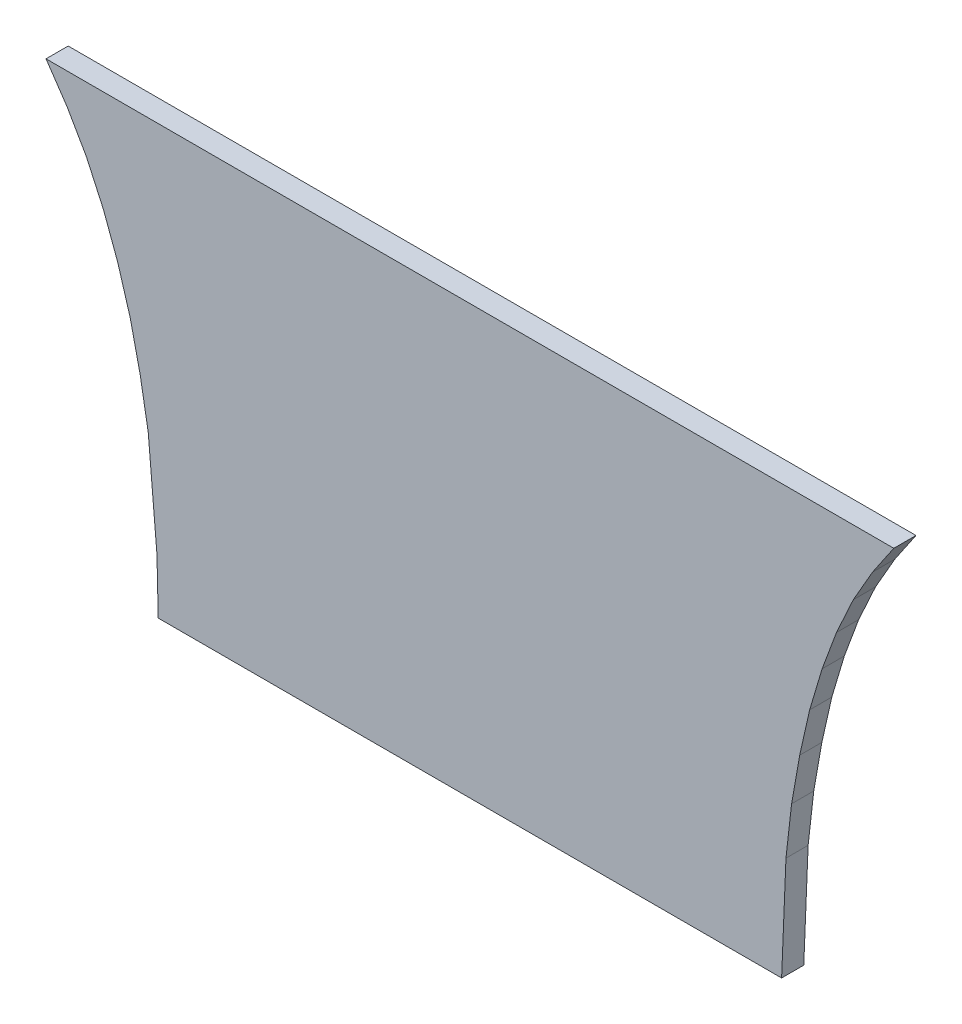
ISO-10303-21;
HEADER;
FILE_DESCRIPTION(('STEP AP214'),'2;1');
FILE_NAME('part.step','',(''),(''),'','','');
FILE_SCHEMA(('AUTOMOTIVE_DESIGN { 1 0 10303 214 1 1 1 1 }'));
ENDSEC;
DATA;
#1=APPLICATION_CONTEXT('core data for automotive mechanical design processes');
#2=APPLICATION_PROTOCOL_DEFINITION('international standard','automotive_design',2000,#1);
#3=PRODUCT_CONTEXT('',#1,'mechanical');
#4=PRODUCT('Part','Part','',(#3));
#5=PRODUCT_RELATED_PRODUCT_CATEGORY('part','',(#4));
#6=PRODUCT_DEFINITION_FORMATION('','',#4);
#7=PRODUCT_DEFINITION_CONTEXT('part definition',#1,'design');
#8=PRODUCT_DEFINITION('design','',#6,#7);
#9=PRODUCT_DEFINITION_SHAPE('','',#8);
#10=(LENGTH_UNIT() NAMED_UNIT(*) SI_UNIT(.MILLI.,.METRE.));
#11=(NAMED_UNIT(*) PLANE_ANGLE_UNIT() SI_UNIT($,.RADIAN.));
#12=(NAMED_UNIT(*) SI_UNIT($,.STERADIAN.) SOLID_ANGLE_UNIT());
#13=UNCERTAINTY_MEASURE_WITH_UNIT(LENGTH_MEASURE(1.E-05),#10,'distance_accuracy_value','');
#14=(GEOMETRIC_REPRESENTATION_CONTEXT(3) GLOBAL_UNCERTAINTY_ASSIGNED_CONTEXT((#13)) GLOBAL_UNIT_ASSIGNED_CONTEXT((#10,
#11,#12)) REPRESENTATION_CONTEXT('',''));
#15=CARTESIAN_POINT('',(0.,0.,0.));
#16=DIRECTION('',(0.,0.,1.));
#17=DIRECTION('',(1.,0.,0.));
#18=AXIS2_PLACEMENT_3D('',#15,#16,#17);
#19=CARTESIAN_POINT('',(57.9199981689453,61.4029998779297,0.));
#20=DIRECTION('',(-0.999153352742579,0.0411409492265821,0.));
#21=DIRECTION('',(0.0411409492265821,0.999153352742579,0.));
#22=AXIS2_PLACEMENT_3D('',#19,#20,#21);
#23=PLANE('',#22);
#24=DIRECTION('',(0.0411409492265821,0.999153352742579,0.));
#25=VECTOR('',#24,1.);
#26=CARTESIAN_POINT('',(57.9199981689453,61.4029998779297,0.03556));
#27=LINE('',#26,#25);
#28=CARTESIAN_POINT('',(57.9199981689453,61.4029998779297,0.03556));
#29=VERTEX_POINT('',#28);
#30=CARTESIAN_POINT('',(57.9269981384277,61.5730018615723,0.03556));
#31=VERTEX_POINT('',#30);
#32=EDGE_CURVE('E11',#29,#31,#27,.T.);
#33=ORIENTED_EDGE('',*,*,#32,.F.);
#34=DIRECTION('',(0.,0.,1.));
#35=VECTOR('',#34,1.);
#36=CARTESIAN_POINT('',(57.9199981689453,61.4029998779297,0.));
#37=LINE('',#36,#35);
#38=CARTESIAN_POINT('',(57.9199981689453,61.4029998779297,0.));
#39=VERTEX_POINT('',#38);
#40=EDGE_CURVE('E24',#39,#29,#37,.T.);
#41=ORIENTED_EDGE('',*,*,#40,.F.);
#42=DIRECTION('',(0.0411409492265821,0.999153352742579,0.));
#43=VECTOR('',#42,1.);
#44=CARTESIAN_POINT('',(57.9199981689453,61.4029998779297,0.));
#45=LINE('',#44,#43);
#46=CARTESIAN_POINT('',(57.9269981384277,61.5730018615723,0.));
#47=VERTEX_POINT('',#46);
#48=EDGE_CURVE('E172',#39,#47,#45,.T.);
#49=ORIENTED_EDGE('',*,*,#48,.T.);
#50=DIRECTION('',(0.,0.,1.));
#51=VECTOR('',#50,1.);
#52=CARTESIAN_POINT('',(57.9269981384277,61.5730018615723,0.));
#53=LINE('',#52,#51);
#54=EDGE_CURVE('E37',#47,#31,#53,.T.);
#55=ORIENTED_EDGE('',*,*,#54,.T.);
#56=EDGE_LOOP('',(#33,#41,#49,#55));
#57=FACE_BOUND('',#56,.T.);
#58=ADVANCED_FACE('F17',(#57),#23,.F.);
#59=CARTESIAN_POINT('',(57.9269981384277,61.5730018615723,0.));
#60=DIRECTION('',(-0.993727301508674,0.111830453080944,0.));
#61=DIRECTION('',(0.111830453080944,0.993727301508674,0.));
#62=AXIS2_PLACEMENT_3D('',#59,#60,#61);
#63=PLANE('',#62);
#64=DIRECTION('',(0.111830453080944,0.993727301508674,0.));
#65=VECTOR('',#64,1.);
#66=CARTESIAN_POINT('',(57.9269981384277,61.5730018615723,0.03556));
#67=LINE('',#66,#65);
#68=CARTESIAN_POINT('',(57.9360008239746,61.6529998779297,0.03556));
#69=VERTEX_POINT('',#68);
#70=EDGE_CURVE('E308',#31,#69,#67,.T.);
#71=ORIENTED_EDGE('',*,*,#70,.F.);
#72=ORIENTED_EDGE('',*,*,#54,.F.);
#73=DIRECTION('',(0.111830453080944,0.993727301508674,0.));
#74=VECTOR('',#73,1.);
#75=CARTESIAN_POINT('',(57.9269981384277,61.5730018615723,0.));
#76=LINE('',#75,#74);
#77=CARTESIAN_POINT('',(57.9360008239746,61.6529998779297,0.));
#78=VERTEX_POINT('',#77);
#79=EDGE_CURVE('E305',#47,#78,#76,.T.);
#80=ORIENTED_EDGE('',*,*,#79,.T.);
#81=DIRECTION('',(0.,0.,1.));
#82=VECTOR('',#81,1.);
#83=CARTESIAN_POINT('',(57.9360008239746,61.6529998779297,0.));
#84=LINE('',#83,#82);
#85=EDGE_CURVE('E303',#78,#69,#84,.T.);
#86=ORIENTED_EDGE('',*,*,#85,.T.);
#87=EDGE_LOOP('',(#71,#72,#80,#86));
#88=FACE_BOUND('',#87,.T.);
#89=ADVANCED_FACE('F316',(#88),#63,.F.);
#90=CARTESIAN_POINT('',(57.9360008239746,61.6529998779297,0.));
#91=DIRECTION('',(-0.984916671687,0.173029332290804,0.));
#92=DIRECTION('',(0.173029332290804,0.984916671687,0.));
#93=AXIS2_PLACEMENT_3D('',#90,#91,#92);
#94=PLANE('',#93);
#95=DIRECTION('',(0.173029332290804,0.984916671687,0.));
#96=VECTOR('',#95,1.);
#97=CARTESIAN_POINT('',(57.9360008239746,61.6529998779297,0.03556));
#98=LINE('',#97,#96);
#99=CARTESIAN_POINT('',(57.9490013122559,61.7270011901855,0.03556));
#100=VERTEX_POINT('',#99);
#101=EDGE_CURVE('E300',#69,#100,#98,.T.);
#102=ORIENTED_EDGE('',*,*,#101,.F.);
#103=ORIENTED_EDGE('',*,*,#85,.F.);
#104=DIRECTION('',(0.173029332290804,0.984916671687,0.));
#105=VECTOR('',#104,1.);
#106=CARTESIAN_POINT('',(57.9360008239746,61.6529998779297,0.));
#107=LINE('',#106,#105);
#108=CARTESIAN_POINT('',(57.9490013122559,61.7270011901855,0.));
#109=VERTEX_POINT('',#108);
#110=EDGE_CURVE('E297',#78,#109,#107,.T.);
#111=ORIENTED_EDGE('',*,*,#110,.T.);
#112=DIRECTION('',(0.,0.,1.));
#113=VECTOR('',#112,1.);
#114=CARTESIAN_POINT('',(57.9490013122559,61.7270011901855,0.));
#115=LINE('',#114,#113);
#116=EDGE_CURVE('E295',#109,#100,#115,.T.);
#117=ORIENTED_EDGE('',*,*,#116,.T.);
#118=EDGE_LOOP('',(#102,#103,#111,#117));
#119=FACE_BOUND('',#118,.T.);
#120=ADVANCED_FACE('F322',(#119),#94,.F.);
#121=CARTESIAN_POINT('',(57.9490013122559,61.7270011901855,0.));
#122=DIRECTION('',(-0.975538987966482,0.219826483748733,0.));
#123=DIRECTION('',(0.219826483748733,0.975538987966482,0.));
#124=AXIS2_PLACEMENT_3D('',#121,#122,#123);
#125=PLANE('',#124);
#126=DIRECTION('',(0.219826483748733,0.975538987966482,0.));
#127=VECTOR('',#126,1.);
#128=CARTESIAN_POINT('',(57.9490013122559,61.7270011901855,0.03556));
#129=LINE('',#128,#127);
#130=CARTESIAN_POINT('',(57.9650001525879,61.7980003356934,0.03556));
#131=VERTEX_POINT('',#130);
#132=EDGE_CURVE('E292',#100,#131,#129,.T.);
#133=ORIENTED_EDGE('',*,*,#132,.F.);
#134=ORIENTED_EDGE('',*,*,#116,.F.);
#135=DIRECTION('',(0.219826483748733,0.975538987966482,0.));
#136=VECTOR('',#135,1.);
#137=CARTESIAN_POINT('',(57.9490013122559,61.7270011901855,0.));
#138=LINE('',#137,#136);
#139=CARTESIAN_POINT('',(57.9650001525879,61.7980003356934,0.));
#140=VERTEX_POINT('',#139);
#141=EDGE_CURVE('E289',#109,#140,#138,.T.);
#142=ORIENTED_EDGE('',*,*,#141,.T.);
#143=DIRECTION('',(0.,0.,1.));
#144=VECTOR('',#143,1.);
#145=CARTESIAN_POINT('',(57.9650001525879,61.7980003356934,0.));
#146=LINE('',#145,#144);
#147=EDGE_CURVE('E287',#140,#131,#146,.T.);
#148=ORIENTED_EDGE('',*,*,#147,.T.);
#149=EDGE_LOOP('',(#133,#134,#142,#148));
#150=FACE_BOUND('',#149,.T.);
#151=ADVANCED_FACE('F324',(#150),#125,.F.);
#152=CARTESIAN_POINT('',(57.9650001525879,61.7980003356934,0.));
#153=DIRECTION('',(-0.958218790223058,0.28603627403436,0.));
#154=DIRECTION('',(0.28603627403436,0.958218790223058,0.));
#155=AXIS2_PLACEMENT_3D('',#152,#153,#154);
#156=PLANE('',#155);
#157=DIRECTION('',(0.28603627403436,0.958218790223058,0.));
#158=VECTOR('',#157,1.);
#159=CARTESIAN_POINT('',(57.9650001525879,61.7980003356934,0.03556));
#160=LINE('',#159,#158);
#161=CARTESIAN_POINT('',(57.9850006103516,61.8650016784668,0.03556));
#162=VERTEX_POINT('',#161);
#163=EDGE_CURVE('E284',#131,#162,#160,.T.);
#164=ORIENTED_EDGE('',*,*,#163,.F.);
#165=ORIENTED_EDGE('',*,*,#147,.F.);
#166=DIRECTION('',(0.28603627403436,0.958218790223058,0.));
#167=VECTOR('',#166,1.);
#168=CARTESIAN_POINT('',(57.9650001525879,61.7980003356934,0.));
#169=LINE('',#168,#167);
#170=CARTESIAN_POINT('',(57.9850006103516,61.8650016784668,0.));
#171=VERTEX_POINT('',#170);
#172=EDGE_CURVE('E281',#140,#171,#169,.T.);
#173=ORIENTED_EDGE('',*,*,#172,.T.);
#174=DIRECTION('',(0.,0.,1.));
#175=VECTOR('',#174,1.);
#176=CARTESIAN_POINT('',(57.9850006103516,61.8650016784668,0.));
#177=LINE('',#176,#175);
#178=EDGE_CURVE('E279',#171,#162,#177,.T.);
#179=ORIENTED_EDGE('',*,*,#178,.T.);
#180=EDGE_LOOP('',(#164,#165,#173,#179));
#181=FACE_BOUND('',#180,.T.);
#182=ADVANCED_FACE('F329',(#181),#156,.F.);
#183=CARTESIAN_POINT('',(57.9850006103516,61.8650016784668,0.));
#184=DIRECTION('',(-0.937565611569886,0.347808458783832,0.));
#185=DIRECTION('',(0.347808458783832,0.937565611569886,0.));
#186=AXIS2_PLACEMENT_3D('',#183,#184,#185);
#187=PLANE('',#186);
#188=DIRECTION('',(0.347808458783832,0.937565611569886,0.));
#189=VECTOR('',#188,1.);
#190=CARTESIAN_POINT('',(57.9850006103516,61.8650016784668,0.03556));
#191=LINE('',#190,#189);
#192=CARTESIAN_POINT('',(58.007999420166,61.9269981384277,0.03556));
#193=VERTEX_POINT('',#192);
#194=EDGE_CURVE('E276',#162,#193,#191,.T.);
#195=ORIENTED_EDGE('',*,*,#194,.F.);
#196=ORIENTED_EDGE('',*,*,#178,.F.);
#197=DIRECTION('',(0.347808458783832,0.937565611569886,0.));
#198=VECTOR('',#197,1.);
#199=CARTESIAN_POINT('',(57.9850006103516,61.8650016784668,0.));
#200=LINE('',#199,#198);
#201=CARTESIAN_POINT('',(58.007999420166,61.9269981384277,0.));
#202=VERTEX_POINT('',#201);
#203=EDGE_CURVE('E273',#171,#202,#200,.T.);
#204=ORIENTED_EDGE('',*,*,#203,.T.);
#205=DIRECTION('',(0.,0.,1.));
#206=VECTOR('',#205,1.);
#207=CARTESIAN_POINT('',(58.007999420166,61.9269981384277,0.));
#208=LINE('',#207,#206);
#209=EDGE_CURVE('E271',#202,#193,#208,.T.);
#210=ORIENTED_EDGE('',*,*,#209,.T.);
#211=EDGE_LOOP('',(#195,#196,#204,#210));
#212=FACE_BOUND('',#211,.T.);
#213=ADVANCED_FACE('F332',(#212),#187,.F.);
#214=CARTESIAN_POINT('',(58.007999420166,61.9269981384277,0.));
#215=DIRECTION('',(-0.909310538221733,0.416118186431333,0.));
#216=DIRECTION('',(0.416118186431333,0.909310538221733,0.));
#217=AXIS2_PLACEMENT_3D('',#214,#215,#216);
#218=PLANE('',#217);
#219=DIRECTION('',(0.416118186431333,0.909310538221733,0.));
#220=VECTOR('',#219,1.);
#221=CARTESIAN_POINT('',(58.007999420166,61.9269981384277,0.03556));
#222=LINE('',#221,#220);
#223=CARTESIAN_POINT('',(58.0349998474121,61.9860000610352,0.03556));
#224=VERTEX_POINT('',#223);
#225=EDGE_CURVE('E268',#193,#224,#222,.T.);
#226=ORIENTED_EDGE('',*,*,#225,.F.);
#227=ORIENTED_EDGE('',*,*,#209,.F.);
#228=DIRECTION('',(0.416118186431333,0.909310538221733,0.));
#229=VECTOR('',#228,1.);
#230=CARTESIAN_POINT('',(58.007999420166,61.9269981384277,0.));
#231=LINE('',#230,#229);
#232=CARTESIAN_POINT('',(58.0349998474121,61.9860000610352,0.));
#233=VERTEX_POINT('',#232);
#234=EDGE_CURVE('E265',#202,#233,#231,.T.);
#235=ORIENTED_EDGE('',*,*,#234,.T.);
#236=DIRECTION('',(0.,0.,1.));
#237=VECTOR('',#236,1.);
#238=CARTESIAN_POINT('',(58.0349998474121,61.9860000610352,0.));
#239=LINE('',#238,#237);
#240=EDGE_CURVE('E263',#233,#224,#239,.T.);
#241=ORIENTED_EDGE('',*,*,#240,.T.);
#242=EDGE_LOOP('',(#226,#227,#235,#241));
#243=FACE_BOUND('',#242,.T.);
#244=ADVANCED_FACE('F337',(#243),#218,.F.);
#245=CARTESIAN_POINT('',(58.0349998474121,61.9860000610352,0.));
#246=DIRECTION('',(-0.86724231986491,0.497886290869039,0.));
#247=DIRECTION('',(0.497886290869039,0.86724231986491,0.));
#248=AXIS2_PLACEMENT_3D('',#245,#246,#247);
#249=PLANE('',#248);
#250=DIRECTION('',(0.497886290869039,0.86724231986491,0.));
#251=VECTOR('',#250,1.);
#252=CARTESIAN_POINT('',(58.0349998474121,61.9860000610352,0.03556));
#253=LINE('',#252,#251);
#254=CARTESIAN_POINT('',(58.0660018920899,62.0400009155274,0.03556));
#255=VERTEX_POINT('',#254);
#256=EDGE_CURVE('E260',#224,#255,#253,.T.);
#257=ORIENTED_EDGE('',*,*,#256,.F.);
#258=ORIENTED_EDGE('',*,*,#240,.F.);
#259=DIRECTION('',(0.497886290869039,0.86724231986491,0.));
#260=VECTOR('',#259,1.);
#261=CARTESIAN_POINT('',(58.0349998474121,61.9860000610352,0.));
#262=LINE('',#261,#260);
#263=CARTESIAN_POINT('',(58.0660018920899,62.0400009155274,0.));
#264=VERTEX_POINT('',#263);
#265=EDGE_CURVE('E257',#233,#264,#262,.T.);
#266=ORIENTED_EDGE('',*,*,#265,.T.);
#267=DIRECTION('',(0.,0.,1.));
#268=VECTOR('',#267,1.);
#269=CARTESIAN_POINT('',(58.0660018920899,62.0400009155274,0.));
#270=LINE('',#269,#268);
#271=EDGE_CURVE('E255',#264,#255,#270,.T.);
#272=ORIENTED_EDGE('',*,*,#271,.T.);
#273=EDGE_LOOP('',(#257,#258,#266,#272));
#274=FACE_BOUND('',#273,.T.);
#275=ADVANCED_FACE('F340',(#274),#249,.F.);
#276=CARTESIAN_POINT('',(58.0660018920899,62.0400009155274,0.));
#277=DIRECTION('',(-0.826948797660334,0.562277232375746,0.));
#278=DIRECTION('',(0.562277232375746,0.826948797660334,0.));
#279=AXIS2_PLACEMENT_3D('',#276,#277,#278);
#280=PLANE('',#279);
#281=DIRECTION('',(0.562277232375746,0.826948797660334,0.));
#282=VECTOR('',#281,1.);
#283=CARTESIAN_POINT('',(58.0660018920899,62.0400009155274,0.03556));
#284=LINE('',#283,#282);
#285=CARTESIAN_POINT('',(58.0999984741211,62.0900001525879,0.03556));
#286=VERTEX_POINT('',#285);
#287=EDGE_CURVE('E252',#255,#286,#284,.T.);
#288=ORIENTED_EDGE('',*,*,#287,.F.);
#289=ORIENTED_EDGE('',*,*,#271,.F.);
#290=DIRECTION('',(0.562277232375746,0.826948797660334,0.));
#291=VECTOR('',#290,1.);
#292=CARTESIAN_POINT('',(58.0660018920899,62.0400009155274,0.));
#293=LINE('',#292,#291);
#294=CARTESIAN_POINT('',(58.0999984741211,62.0900001525879,0.));
#295=VERTEX_POINT('',#294);
#296=EDGE_CURVE('E249',#264,#295,#293,.T.);
#297=ORIENTED_EDGE('',*,*,#296,.T.);
#298=DIRECTION('',(0.,0.,1.));
#299=VECTOR('',#298,1.);
#300=CARTESIAN_POINT('',(58.0999984741211,62.0900001525879,0.));
#301=LINE('',#300,#299);
#302=EDGE_CURVE('E247',#295,#286,#301,.T.);
#303=ORIENTED_EDGE('',*,*,#302,.T.);
#304=EDGE_LOOP('',(#288,#289,#297,#303));
#305=FACE_BOUND('',#304,.T.);
#306=ADVANCED_FACE('F345',(#305),#280,.F.);
#307=CARTESIAN_POINT('',(58.0999984741211,62.0900001525879,0.));
#308=DIRECTION('',(0.,-1.,0.));
#309=DIRECTION('',(-1.,0.,0.));
#310=AXIS2_PLACEMENT_3D('',#307,#308,#309);
#311=PLANE('',#310);
#312=DIRECTION('',(-1.,0.,0.));
#313=VECTOR('',#312,1.);
#314=CARTESIAN_POINT('',(58.0999984741211,62.0900001525879,0.03556));
#315=LINE('',#314,#313);
#316=CARTESIAN_POINT('',(56.7400016784668,62.0900001525879,0.03556));
#317=VERTEX_POINT('',#316);
#318=EDGE_CURVE('E244',#286,#317,#315,.T.);
#319=ORIENTED_EDGE('',*,*,#318,.F.);
#320=ORIENTED_EDGE('',*,*,#302,.F.);
#321=DIRECTION('',(-1.,0.,0.));
#322=VECTOR('',#321,1.);
#323=CARTESIAN_POINT('',(58.0999984741211,62.0900001525879,0.));
#324=LINE('',#323,#322);
#325=CARTESIAN_POINT('',(56.7400016784668,62.0900001525879,0.));
#326=VERTEX_POINT('',#325);
#327=EDGE_CURVE('E241',#295,#326,#324,.T.);
#328=ORIENTED_EDGE('',*,*,#327,.T.);
#329=DIRECTION('',(0.,0.,1.));
#330=VECTOR('',#329,1.);
#331=CARTESIAN_POINT('',(56.7400016784668,62.0900001525879,0.));
#332=LINE('',#331,#330);
#333=EDGE_CURVE('E239',#326,#317,#332,.T.);
#334=ORIENTED_EDGE('',*,*,#333,.T.);
#335=EDGE_LOOP('',(#319,#320,#328,#334));
#336=FACE_BOUND('',#335,.T.);
#337=ADVANCED_FACE('F348',(#336),#311,.F.);
#338=CARTESIAN_POINT('',(56.7400016784668,62.0900001525879,0.));
#339=DIRECTION('',(0.826948797660334,0.562277232375746,0.));
#340=DIRECTION('',(0.562277232375746,-0.826948797660334,0.));
#341=AXIS2_PLACEMENT_3D('',#338,#339,#340);
#342=PLANE('',#341);
#343=DIRECTION('',(0.562277232375746,-0.826948797660334,0.));
#344=VECTOR('',#343,1.);
#345=CARTESIAN_POINT('',(56.7400016784668,62.0900001525879,0.03556));
#346=LINE('',#345,#344);
#347=CARTESIAN_POINT('',(56.7739982604981,62.0400009155274,0.03556));
#348=VERTEX_POINT('',#347);
#349=EDGE_CURVE('E236',#317,#348,#346,.T.);
#350=ORIENTED_EDGE('',*,*,#349,.F.);
#351=ORIENTED_EDGE('',*,*,#333,.F.);
#352=DIRECTION('',(0.562277232375746,-0.826948797660334,0.));
#353=VECTOR('',#352,1.);
#354=CARTESIAN_POINT('',(56.7400016784668,62.0900001525879,0.));
#355=LINE('',#354,#353);
#356=CARTESIAN_POINT('',(56.7739982604981,62.0400009155274,0.));
#357=VERTEX_POINT('',#356);
#358=EDGE_CURVE('E233',#326,#357,#355,.T.);
#359=ORIENTED_EDGE('',*,*,#358,.T.);
#360=DIRECTION('',(0.,0.,1.));
#361=VECTOR('',#360,1.);
#362=CARTESIAN_POINT('',(56.7739982604981,62.0400009155274,0.));
#363=LINE('',#362,#361);
#364=EDGE_CURVE('E231',#357,#348,#363,.T.);
#365=ORIENTED_EDGE('',*,*,#364,.T.);
#366=EDGE_LOOP('',(#350,#351,#359,#365));
#367=FACE_BOUND('',#366,.T.);
#368=ADVANCED_FACE('F353',(#367),#342,.F.);
#369=CARTESIAN_POINT('',(56.7739982604981,62.0400009155274,0.));
#370=DIRECTION('',(0.86724231986491,0.497886290869039,0.));
#371=DIRECTION('',(0.497886290869039,-0.86724231986491,0.));
#372=AXIS2_PLACEMENT_3D('',#369,#370,#371);
#373=PLANE('',#372);
#374=DIRECTION('',(0.497886290869039,-0.86724231986491,0.));
#375=VECTOR('',#374,1.);
#376=CARTESIAN_POINT('',(56.7739982604981,62.0400009155274,0.03556));
#377=LINE('',#376,#375);
#378=CARTESIAN_POINT('',(56.8050003051758,61.9860000610352,0.03556));
#379=VERTEX_POINT('',#378);
#380=EDGE_CURVE('E228',#348,#379,#377,.T.);
#381=ORIENTED_EDGE('',*,*,#380,.F.);
#382=ORIENTED_EDGE('',*,*,#364,.F.);
#383=DIRECTION('',(0.497886290869039,-0.86724231986491,0.));
#384=VECTOR('',#383,1.);
#385=CARTESIAN_POINT('',(56.7739982604981,62.0400009155274,0.));
#386=LINE('',#385,#384);
#387=CARTESIAN_POINT('',(56.8050003051758,61.9860000610352,0.));
#388=VERTEX_POINT('',#387);
#389=EDGE_CURVE('E225',#357,#388,#386,.T.);
#390=ORIENTED_EDGE('',*,*,#389,.T.);
#391=DIRECTION('',(0.,0.,1.));
#392=VECTOR('',#391,1.);
#393=CARTESIAN_POINT('',(56.8050003051758,61.9860000610352,0.));
#394=LINE('',#393,#392);
#395=EDGE_CURVE('E223',#388,#379,#394,.T.);
#396=ORIENTED_EDGE('',*,*,#395,.T.);
#397=EDGE_LOOP('',(#381,#382,#390,#396));
#398=FACE_BOUND('',#397,.T.);
#399=ADVANCED_FACE('F356',(#398),#373,.F.);
#400=CARTESIAN_POINT('',(56.8050003051758,61.9860000610352,0.));
#401=DIRECTION('',(0.909310538221733,0.416118186431333,0.));
#402=DIRECTION('',(0.416118186431333,-0.909310538221733,0.));
#403=AXIS2_PLACEMENT_3D('',#400,#401,#402);
#404=PLANE('',#403);
#405=DIRECTION('',(0.416118186431333,-0.909310538221733,0.));
#406=VECTOR('',#405,1.);
#407=CARTESIAN_POINT('',(56.8050003051758,61.9860000610352,0.03556));
#408=LINE('',#407,#406);
#409=CARTESIAN_POINT('',(56.8320007324219,61.9269981384277,0.03556));
#410=VERTEX_POINT('',#409);
#411=EDGE_CURVE('E220',#379,#410,#408,.T.);
#412=ORIENTED_EDGE('',*,*,#411,.F.);
#413=ORIENTED_EDGE('',*,*,#395,.F.);
#414=DIRECTION('',(0.416118186431333,-0.909310538221733,0.));
#415=VECTOR('',#414,1.);
#416=CARTESIAN_POINT('',(56.8050003051758,61.9860000610352,0.));
#417=LINE('',#416,#415);
#418=CARTESIAN_POINT('',(56.8320007324219,61.9269981384277,0.));
#419=VERTEX_POINT('',#418);
#420=EDGE_CURVE('E217',#388,#419,#417,.T.);
#421=ORIENTED_EDGE('',*,*,#420,.T.);
#422=DIRECTION('',(0.,0.,1.));
#423=VECTOR('',#422,1.);
#424=CARTESIAN_POINT('',(56.8320007324219,61.9269981384277,0.));
#425=LINE('',#424,#423);
#426=EDGE_CURVE('E215',#419,#410,#425,.T.);
#427=ORIENTED_EDGE('',*,*,#426,.T.);
#428=EDGE_LOOP('',(#412,#413,#421,#427));
#429=FACE_BOUND('',#428,.T.);
#430=ADVANCED_FACE('F361',(#429),#404,.F.);
#431=CARTESIAN_POINT('',(56.8320007324219,61.9269981384277,0.));
#432=DIRECTION('',(0.937565611569886,0.347808458783832,0.));
#433=DIRECTION('',(0.347808458783832,-0.937565611569886,0.));
#434=AXIS2_PLACEMENT_3D('',#431,#432,#433);
#435=PLANE('',#434);
#436=DIRECTION('',(0.347808458783832,-0.937565611569886,0.));
#437=VECTOR('',#436,1.);
#438=CARTESIAN_POINT('',(56.8320007324219,61.9269981384277,0.03556));
#439=LINE('',#438,#437);
#440=CARTESIAN_POINT('',(56.8549995422363,61.8650016784668,0.03556));
#441=VERTEX_POINT('',#440);
#442=EDGE_CURVE('E212',#410,#441,#439,.T.);
#443=ORIENTED_EDGE('',*,*,#442,.F.);
#444=ORIENTED_EDGE('',*,*,#426,.F.);
#445=DIRECTION('',(0.347808458783832,-0.937565611569886,0.));
#446=VECTOR('',#445,1.);
#447=CARTESIAN_POINT('',(56.8320007324219,61.9269981384277,0.));
#448=LINE('',#447,#446);
#449=CARTESIAN_POINT('',(56.8549995422363,61.8650016784668,0.));
#450=VERTEX_POINT('',#449);
#451=EDGE_CURVE('E209',#419,#450,#448,.T.);
#452=ORIENTED_EDGE('',*,*,#451,.T.);
#453=DIRECTION('',(0.,0.,1.));
#454=VECTOR('',#453,1.);
#455=CARTESIAN_POINT('',(56.8549995422363,61.8650016784668,0.));
#456=LINE('',#455,#454);
#457=EDGE_CURVE('E207',#450,#441,#456,.T.);
#458=ORIENTED_EDGE('',*,*,#457,.T.);
#459=EDGE_LOOP('',(#443,#444,#452,#458));
#460=FACE_BOUND('',#459,.T.);
#461=ADVANCED_FACE('F364',(#460),#435,.F.);
#462=CARTESIAN_POINT('',(56.8549995422363,61.8650016784668,0.));
#463=DIRECTION('',(0.958218790223058,0.28603627403436,0.));
#464=DIRECTION('',(0.28603627403436,-0.958218790223058,0.));
#465=AXIS2_PLACEMENT_3D('',#462,#463,#464);
#466=PLANE('',#465);
#467=DIRECTION('',(0.28603627403436,-0.958218790223058,0.));
#468=VECTOR('',#467,1.);
#469=CARTESIAN_POINT('',(56.8549995422363,61.8650016784668,0.03556));
#470=LINE('',#469,#468);
#471=CARTESIAN_POINT('',(56.875,61.7980003356934,0.03556));
#472=VERTEX_POINT('',#471);
#473=EDGE_CURVE('E204',#441,#472,#470,.T.);
#474=ORIENTED_EDGE('',*,*,#473,.F.);
#475=ORIENTED_EDGE('',*,*,#457,.F.);
#476=DIRECTION('',(0.28603627403436,-0.958218790223058,0.));
#477=VECTOR('',#476,1.);
#478=CARTESIAN_POINT('',(56.8549995422363,61.8650016784668,0.));
#479=LINE('',#478,#477);
#480=CARTESIAN_POINT('',(56.875,61.7980003356934,0.));
#481=VERTEX_POINT('',#480);
#482=EDGE_CURVE('E201',#450,#481,#479,.T.);
#483=ORIENTED_EDGE('',*,*,#482,.T.);
#484=DIRECTION('',(0.,0.,1.));
#485=VECTOR('',#484,1.);
#486=CARTESIAN_POINT('',(56.875,61.7980003356934,0.));
#487=LINE('',#486,#485);
#488=EDGE_CURVE('E199',#481,#472,#487,.T.);
#489=ORIENTED_EDGE('',*,*,#488,.T.);
#490=EDGE_LOOP('',(#474,#475,#483,#489));
#491=FACE_BOUND('',#490,.T.);
#492=ADVANCED_FACE('F369',(#491),#466,.F.);
#493=CARTESIAN_POINT('',(56.875,61.7980003356934,0.));
#494=DIRECTION('',(0.975538987966482,0.219826483748733,0.));
#495=DIRECTION('',(0.219826483748733,-0.975538987966482,0.));
#496=AXIS2_PLACEMENT_3D('',#493,#494,#495);
#497=PLANE('',#496);
#498=DIRECTION('',(0.219826483748733,-0.975538987966482,0.));
#499=VECTOR('',#498,1.);
#500=CARTESIAN_POINT('',(56.875,61.7980003356934,0.03556));
#501=LINE('',#500,#499);
#502=CARTESIAN_POINT('',(56.890998840332,61.7270011901855,0.03556));
#503=VERTEX_POINT('',#502);
#504=EDGE_CURVE('E196',#472,#503,#501,.T.);
#505=ORIENTED_EDGE('',*,*,#504,.F.);
#506=ORIENTED_EDGE('',*,*,#488,.F.);
#507=DIRECTION('',(0.219826483748733,-0.975538987966482,0.));
#508=VECTOR('',#507,1.);
#509=CARTESIAN_POINT('',(56.875,61.7980003356934,0.));
#510=LINE('',#509,#508);
#511=CARTESIAN_POINT('',(56.890998840332,61.7270011901855,0.));
#512=VERTEX_POINT('',#511);
#513=EDGE_CURVE('E193',#481,#512,#510,.T.);
#514=ORIENTED_EDGE('',*,*,#513,.T.);
#515=DIRECTION('',(0.,0.,1.));
#516=VECTOR('',#515,1.);
#517=CARTESIAN_POINT('',(56.890998840332,61.7270011901855,0.));
#518=LINE('',#517,#516);
#519=EDGE_CURVE('E191',#512,#503,#518,.T.);
#520=ORIENTED_EDGE('',*,*,#519,.T.);
#521=EDGE_LOOP('',(#505,#506,#514,#520));
#522=FACE_BOUND('',#521,.T.);
#523=ADVANCED_FACE('F372',(#522),#497,.F.);
#524=CARTESIAN_POINT('',(56.890998840332,61.7270011901855,0.));
#525=DIRECTION('',(0.984916671687,0.173029332290804,0.));
#526=DIRECTION('',(0.173029332290804,-0.984916671687,0.));
#527=AXIS2_PLACEMENT_3D('',#524,#525,#526);
#528=PLANE('',#527);
#529=DIRECTION('',(0.173029332290804,-0.984916671687,0.));
#530=VECTOR('',#529,1.);
#531=CARTESIAN_POINT('',(56.890998840332,61.7270011901855,0.03556));
#532=LINE('',#531,#530);
#533=CARTESIAN_POINT('',(56.9039993286133,61.6529998779297,0.03556));
#534=VERTEX_POINT('',#533);
#535=EDGE_CURVE('E188',#503,#534,#532,.T.);
#536=ORIENTED_EDGE('',*,*,#535,.F.);
#537=ORIENTED_EDGE('',*,*,#519,.F.);
#538=DIRECTION('',(0.173029332290804,-0.984916671687,0.));
#539=VECTOR('',#538,1.);
#540=CARTESIAN_POINT('',(56.890998840332,61.7270011901855,0.));
#541=LINE('',#540,#539);
#542=CARTESIAN_POINT('',(56.9039993286133,61.6529998779297,0.));
#543=VERTEX_POINT('',#542);
#544=EDGE_CURVE('E185',#512,#543,#541,.T.);
#545=ORIENTED_EDGE('',*,*,#544,.T.);
#546=DIRECTION('',(0.,0.,1.));
#547=VECTOR('',#546,1.);
#548=CARTESIAN_POINT('',(56.9039993286133,61.6529998779297,0.));
#549=LINE('',#548,#547);
#550=EDGE_CURVE('E183',#543,#534,#549,.T.);
#551=ORIENTED_EDGE('',*,*,#550,.T.);
#552=EDGE_LOOP('',(#536,#537,#545,#551));
#553=FACE_BOUND('',#552,.T.);
#554=ADVANCED_FACE('F377',(#553),#528,.F.);
#555=CARTESIAN_POINT('',(56.9039993286133,61.6529998779297,0.));
#556=DIRECTION('',(0.996331725046175,0.0855750761992899,0.));
#557=DIRECTION('',(0.0855750761992899,-0.996331725046175,0.));
#558=AXIS2_PLACEMENT_3D('',#555,#556,#557);
#559=PLANE('',#558);
#560=DIRECTION('',(0.0855750761992899,-0.996331725046175,0.));
#561=VECTOR('',#560,1.);
#562=CARTESIAN_POINT('',(56.9039993286133,61.6529998779297,0.03556));
#563=LINE('',#562,#561);
#564=CARTESIAN_POINT('',(56.9179992675781,61.4900016784668,0.03556));
#565=VERTEX_POINT('',#564);
#566=EDGE_CURVE('E180',#534,#565,#563,.T.);
#567=ORIENTED_EDGE('',*,*,#566,.F.);
#568=ORIENTED_EDGE('',*,*,#550,.F.);
#569=DIRECTION('',(0.0855750761992899,-0.996331725046175,0.));
#570=VECTOR('',#569,1.);
#571=CARTESIAN_POINT('',(56.9039993286133,61.6529998779297,0.));
#572=LINE('',#571,#570);
#573=CARTESIAN_POINT('',(56.9179992675781,61.4900016784668,0.));
#574=VERTEX_POINT('',#573);
#575=EDGE_CURVE('E178',#543,#574,#572,.T.);
#576=ORIENTED_EDGE('',*,*,#575,.T.);
#577=DIRECTION('',(0.,0.,1.));
#578=VECTOR('',#577,1.);
#579=CARTESIAN_POINT('',(56.9179992675781,61.4900016784668,0.));
#580=LINE('',#579,#578);
#581=EDGE_CURVE('E163',#574,#565,#580,.T.);
#582=ORIENTED_EDGE('',*,*,#581,.T.);
#583=EDGE_LOOP('',(#567,#568,#576,#582));
#584=FACE_BOUND('',#583,.T.);
#585=ADVANCED_FACE('F379',(#584),#559,.F.);
#586=CARTESIAN_POINT('',(56.9179992675781,61.4900016784668,0.));
#587=DIRECTION('',(0.999736169891065,0.0229693406858823,0.));
#588=DIRECTION('',(0.0229693406858823,-0.999736169891065,0.));
#589=AXIS2_PLACEMENT_3D('',#586,#587,#588);
#590=PLANE('',#589);
#591=DIRECTION('',(0.0229693406858823,-0.999736169891065,0.));
#592=VECTOR('',#591,1.);
#593=CARTESIAN_POINT('',(56.9179992675781,61.4900016784668,0.03556));
#594=LINE('',#593,#592);
#595=CARTESIAN_POINT('',(56.9199981689453,61.4029998779297,0.03556));
#596=VERTEX_POINT('',#595);
#597=EDGE_CURVE('E167',#565,#596,#594,.T.);
#598=ORIENTED_EDGE('',*,*,#597,.F.);
#599=ORIENTED_EDGE('',*,*,#581,.F.);
#600=DIRECTION('',(0.0229693406858823,-0.999736169891065,0.));
#601=VECTOR('',#600,1.);
#602=CARTESIAN_POINT('',(56.9179992675781,61.4900016784668,0.));
#603=LINE('',#602,#601);
#604=CARTESIAN_POINT('',(56.9199981689453,61.4029998779297,0.));
#605=VERTEX_POINT('',#604);
#606=EDGE_CURVE('E159',#574,#605,#603,.T.);
#607=ORIENTED_EDGE('',*,*,#606,.T.);
#608=DIRECTION('',(0.,0.,1.));
#609=VECTOR('',#608,1.);
#610=CARTESIAN_POINT('',(56.9199981689453,61.4029998779297,0.));
#611=LINE('',#610,#609);
#612=EDGE_CURVE('E149',#605,#596,#611,.T.);
#613=ORIENTED_EDGE('',*,*,#612,.T.);
#614=EDGE_LOOP('',(#598,#599,#607,#613));
#615=FACE_BOUND('',#614,.T.);
#616=ADVANCED_FACE('F162',(#615),#590,.F.);
#617=CARTESIAN_POINT('',(56.9199981689453,61.4029998779297,0.));
#618=DIRECTION('',(0.,1.,0.));
#619=DIRECTION('',(1.,0.,0.));
#620=AXIS2_PLACEMENT_3D('',#617,#618,#619);
#621=PLANE('',#620);
#622=DIRECTION('',(1.,0.,0.));
#623=VECTOR('',#622,1.);
#624=CARTESIAN_POINT('',(56.9199981689453,61.4029998779297,0.03556));
#625=LINE('',#624,#623);
#626=EDGE_CURVE('E155',#596,#29,#625,.T.);
#627=ORIENTED_EDGE('',*,*,#626,.F.);
#628=ORIENTED_EDGE('',*,*,#612,.F.);
#629=DIRECTION('',(1.,0.,0.));
#630=VECTOR('',#629,1.);
#631=CARTESIAN_POINT('',(56.9199981689453,61.4029998779297,0.));
#632=LINE('',#631,#630);
#633=EDGE_CURVE('E153',#605,#39,#632,.T.);
#634=ORIENTED_EDGE('',*,*,#633,.T.);
#635=ORIENTED_EDGE('',*,*,#40,.T.);
#636=EDGE_LOOP('',(#627,#628,#634,#635));
#637=FACE_BOUND('',#636,.T.);
#638=ADVANCED_FACE('F151',(#637),#621,.F.);
#639=CARTESIAN_POINT('',(57.9199981689453,61.4029998779297,0.));
#640=DIRECTION('',(0.,0.,1.));
#641=DIRECTION('',(1.,0.,0.));
#642=AXIS2_PLACEMENT_3D('',#639,#640,#641);
#643=PLANE('',#642);
#644=ORIENTED_EDGE('',*,*,#633,.F.);
#645=ORIENTED_EDGE('',*,*,#606,.F.);
#646=ORIENTED_EDGE('',*,*,#575,.F.);
#647=ORIENTED_EDGE('',*,*,#544,.F.);
#648=ORIENTED_EDGE('',*,*,#513,.F.);
#649=ORIENTED_EDGE('',*,*,#482,.F.);
#650=ORIENTED_EDGE('',*,*,#451,.F.);
#651=ORIENTED_EDGE('',*,*,#420,.F.);
#652=ORIENTED_EDGE('',*,*,#389,.F.);
#653=ORIENTED_EDGE('',*,*,#358,.F.);
#654=ORIENTED_EDGE('',*,*,#327,.F.);
#655=ORIENTED_EDGE('',*,*,#296,.F.);
#656=ORIENTED_EDGE('',*,*,#265,.F.);
#657=ORIENTED_EDGE('',*,*,#234,.F.);
#658=ORIENTED_EDGE('',*,*,#203,.F.);
#659=ORIENTED_EDGE('',*,*,#172,.F.);
#660=ORIENTED_EDGE('',*,*,#141,.F.);
#661=ORIENTED_EDGE('',*,*,#110,.F.);
#662=ORIENTED_EDGE('',*,*,#79,.F.);
#663=ORIENTED_EDGE('',*,*,#48,.F.);
#664=EDGE_LOOP('',(#644,#645,#646,#647,#648,#649,#650,#651,#652,#653,#654,#655,#656,#657,#658,
#659,#660,#661,#662,#663));
#665=FACE_BOUND('',#664,.T.);
#666=ADVANCED_FACE('F170',(#665),#643,.F.);
#667=CARTESIAN_POINT('',(57.9199981689453,61.4029998779297,0.03556));
#668=DIRECTION('',(0.,0.,1.));
#669=DIRECTION('',(1.,0.,0.));
#670=AXIS2_PLACEMENT_3D('',#667,#668,#669);
#671=PLANE('',#670);
#672=ORIENTED_EDGE('',*,*,#32,.T.);
#673=ORIENTED_EDGE('',*,*,#70,.T.);
#674=ORIENTED_EDGE('',*,*,#101,.T.);
#675=ORIENTED_EDGE('',*,*,#132,.T.);
#676=ORIENTED_EDGE('',*,*,#163,.T.);
#677=ORIENTED_EDGE('',*,*,#194,.T.);
#678=ORIENTED_EDGE('',*,*,#225,.T.);
#679=ORIENTED_EDGE('',*,*,#256,.T.);
#680=ORIENTED_EDGE('',*,*,#287,.T.);
#681=ORIENTED_EDGE('',*,*,#318,.T.);
#682=ORIENTED_EDGE('',*,*,#349,.T.);
#683=ORIENTED_EDGE('',*,*,#380,.T.);
#684=ORIENTED_EDGE('',*,*,#411,.T.);
#685=ORIENTED_EDGE('',*,*,#442,.T.);
#686=ORIENTED_EDGE('',*,*,#473,.T.);
#687=ORIENTED_EDGE('',*,*,#504,.T.);
#688=ORIENTED_EDGE('',*,*,#535,.T.);
#689=ORIENTED_EDGE('',*,*,#566,.T.);
#690=ORIENTED_EDGE('',*,*,#597,.T.);
#691=ORIENTED_EDGE('',*,*,#626,.T.);
#692=EDGE_LOOP('',(#672,#673,#674,#675,#676,#677,#678,#679,#680,#681,#682,#683,#684,#685,#686,
#687,#688,#689,#690,#691));
#693=FACE_BOUND('',#692,.T.);
#694=ADVANCED_FACE('F319',(#693),#671,.T.);
#695=CLOSED_SHELL('',(#58,#89,#120,#151,#182,#213,#244,#275,#306,#337,#368,#399,#430,#461,#492,
#523,#554,#585,#616,#638,#666,#694));
#696=MANIFOLD_SOLID_BREP('B1',#695);
#697=ADVANCED_BREP_SHAPE_REPRESENTATION('',(#18,#696),#14);
#698=SHAPE_DEFINITION_REPRESENTATION(#9,#697);
ENDSEC;
END-ISO-10303-21;
